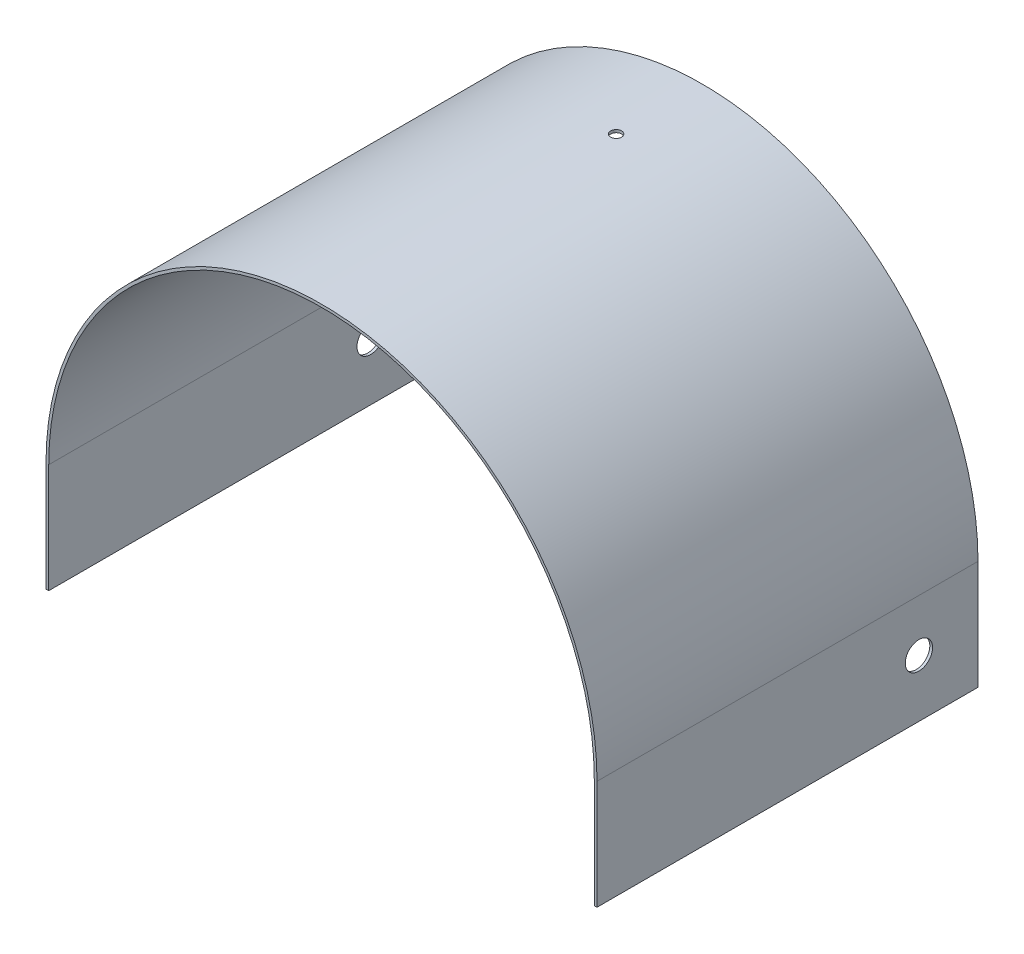
ISO-10303-21;
HEADER;
FILE_DESCRIPTION(('STEP AP214'),'2;1');
FILE_NAME('part.step','',(''),(''),'','','');
FILE_SCHEMA(('AUTOMOTIVE_DESIGN { 1 0 10303 214 1 1 1 1 }'));
ENDSEC;
DATA;
#1=APPLICATION_CONTEXT('core data for automotive mechanical design processes');
#2=APPLICATION_PROTOCOL_DEFINITION('international standard','automotive_design',2000,#1);
#3=PRODUCT_CONTEXT('',#1,'mechanical');
#4=PRODUCT('Part','Part','',(#3));
#5=PRODUCT_RELATED_PRODUCT_CATEGORY('part','',(#4));
#6=PRODUCT_DEFINITION_FORMATION('','',#4);
#7=PRODUCT_DEFINITION_CONTEXT('part definition',#1,'design');
#8=PRODUCT_DEFINITION('design','',#6,#7);
#9=PRODUCT_DEFINITION_SHAPE('','',#8);
#10=(LENGTH_UNIT() NAMED_UNIT(*) SI_UNIT(.MILLI.,.METRE.));
#11=(NAMED_UNIT(*) PLANE_ANGLE_UNIT() SI_UNIT($,.RADIAN.));
#12=(NAMED_UNIT(*) SI_UNIT($,.STERADIAN.) SOLID_ANGLE_UNIT());
#13=UNCERTAINTY_MEASURE_WITH_UNIT(LENGTH_MEASURE(1.E-05),#10,'distance_accuracy_value','');
#14=(GEOMETRIC_REPRESENTATION_CONTEXT(3) GLOBAL_UNCERTAINTY_ASSIGNED_CONTEXT((#13)) GLOBAL_UNIT_ASSIGNED_CONTEXT((#10,
#11,#12)) REPRESENTATION_CONTEXT('',''));
#15=CARTESIAN_POINT('',(0.,0.,0.));
#16=DIRECTION('',(0.,0.,1.));
#17=DIRECTION('',(1.,0.,0.));
#18=AXIS2_PLACEMENT_3D('',#15,#16,#17);
#19=CARTESIAN_POINT('',(0.,0.,419.));
#20=DIRECTION('',(0.,0.,-1.));
#21=DIRECTION('',(-1.,0.,0.));
#22=AXIS2_PLACEMENT_3D('',#19,#20,#21);
#23=CYLINDRICAL_SURFACE('',#22,300.);
#24=CARTESIAN_POINT('',(0.,0.,0.));
#25=DIRECTION('',(0.,0.,-1.));
#26=DIRECTION('',(1.,0.,0.));
#27=AXIS2_PLACEMENT_3D('',#24,#25,#26);
#28=CIRCLE('',#27,300.);
#29=CARTESIAN_POINT('',(-300.,0.,0.));
#30=VERTEX_POINT('',#29);
#31=CARTESIAN_POINT('',(300.,0.,0.));
#32=VERTEX_POINT('',#31);
#33=EDGE_CURVE('E143',#30,#32,#28,.T.);
#34=ORIENTED_EDGE('',*,*,#33,.T.);
#35=DIRECTION('',(0.,0.,-1.));
#36=VECTOR('',#35,1.);
#37=CARTESIAN_POINT('',(300.,0.,419.));
#38=LINE('',#37,#36);
#39=CARTESIAN_POINT('',(300.,0.,419.));
#40=VERTEX_POINT('',#39);
#41=EDGE_CURVE('E11',#40,#32,#38,.T.);
#42=ORIENTED_EDGE('',*,*,#41,.F.);
#43=CARTESIAN_POINT('',(0.,0.,419.));
#44=DIRECTION('',(0.,0.,-1.));
#45=DIRECTION('',(1.,0.,0.));
#46=AXIS2_PLACEMENT_3D('',#43,#44,#45);
#47=CIRCLE('',#46,300.);
#48=CARTESIAN_POINT('',(-300.,0.,419.));
#49=VERTEX_POINT('',#48);
#50=EDGE_CURVE('E166',#49,#40,#47,.T.);
#51=ORIENTED_EDGE('',*,*,#50,.F.);
#52=DIRECTION('',(0.,0.,-1.));
#53=VECTOR('',#52,1.);
#54=CARTESIAN_POINT('',(-300.,0.,419.));
#55=LINE('',#54,#53);
#56=EDGE_CURVE('E139',#49,#30,#55,.T.);
#57=ORIENTED_EDGE('',*,*,#56,.T.);
#58=EDGE_LOOP('',(#34,#42,#51,#57));
#59=FACE_BOUND('',#58,.T.);
#60=CARTESIAN_POINT('',(0.,300.,89.));
#61=CARTESIAN_POINT('',(0.168553858230472,300.000000068241,88.9999987733988));
#62=CARTESIAN_POINT('',(0.337087651004228,299.99985764915,89.0071055103724));
#63=CARTESIAN_POINT('',(0.67301334155086,299.999292096897,89.0354827302589));
#64=CARTESIAN_POINT('',(0.840404928349149,299.998868890145,89.0567569262242));
#65=CARTESIAN_POINT('',(1.17294656341957,299.997753113541,89.113348070108));
#66=CARTESIAN_POINT('',(1.33809448898002,299.997060304805,89.1486774724823));
#67=CARTESIAN_POINT('',(1.66488525226105,299.995424742031,89.2331422622268));
#68=CARTESIAN_POINT('',(1.82652678585594,299.994481896666,89.2822826945901));
#69=CARTESIAN_POINT('',(2.14495498208429,299.992374069846,89.3939664874669));
#70=CARTESIAN_POINT('',(2.30174565622852,299.991209277968,89.4564984151098));
#71=CARTESIAN_POINT('',(2.60955876874224,299.988689626029,89.5945706394047));
#72=CARTESIAN_POINT('',(2.76057905908212,299.987334696048,89.6701157236691));
#73=CARTESIAN_POINT('',(3.05562545339804,299.984474445913,89.8336104098739));
#74=CARTESIAN_POINT('',(3.19965580676147,299.982969218874,89.9215523451334));
#75=CARTESIAN_POINT('',(3.47985102215616,299.979849786212,90.109285778045));
#76=CARTESIAN_POINT('',(3.61601296124547,299.978235540568,90.209081637637));
#77=CARTESIAN_POINT('',(3.87942790635487,299.974944604516,90.4197729574059));
#78=CARTESIAN_POINT('',(4.00668215049199,299.973267922836,90.5306668697922));
#79=CARTESIAN_POINT('',(4.25144399262742,299.969898845993,90.7628210496901));
#80=CARTESIAN_POINT('',(4.36894797414363,299.968206445256,90.8840851300492));
#81=CARTESIAN_POINT('',(4.59328450657041,299.964855145037,91.1360408756582));
#82=CARTESIAN_POINT('',(4.70012056095244,299.963196234701,91.2667294213598));
#83=CARTESIAN_POINT('',(4.90244361565842,299.959957811916,91.5366907494251));
#84=CARTESIAN_POINT('',(4.99792641123446,299.958378329008,91.67596668336));
#85=CARTESIAN_POINT('',(5.17679089555855,299.955344741005,91.9620267361333));
#86=CARTESIAN_POINT('',(5.26017625038389,299.953890597981,92.1088085620301));
#87=CARTESIAN_POINT('',(5.41431594593107,299.951147900909,92.4089276392836));
#88=CARTESIAN_POINT('',(5.48506561136854,299.949859408202,92.5622672911741));
#89=CARTESIAN_POINT('',(5.61336909566321,299.947485766099,92.8743187379935));
#90=CARTESIAN_POINT('',(5.67092781073235,299.946400541282,93.0330285144561));
#91=CARTESIAN_POINT('',(5.77249070523254,299.944463010282,93.3547460350251));
#92=CARTESIAN_POINT('',(5.81648987328939,299.943610790226,93.5177553440599));
#93=CARTESIAN_POINT('',(5.92756222158679,299.941443980162,94.0113428689411));
#94=CARTESIAN_POINT('',(5.97386675736383,299.940516246092,94.3468623289017));
#95=CARTESIAN_POINT('',(6.00945759144473,299.939805099534,95.020731511803));
#96=CARTESIAN_POINT('',(5.99874404797377,299.940021683872,95.3590812268872));
#97=CARTESIAN_POINT('',(5.92068277966605,299.941572686304,96.0291781593714));
#98=CARTESIAN_POINT('',(5.85334314497856,299.942906944718,96.3609263130037));
#99=CARTESIAN_POINT('',(5.66393402146864,299.946543143238,97.0083950832594));
#100=CARTESIAN_POINT('',(5.54186444696804,299.948845084859,97.3241156747911));
#101=CARTESIAN_POINT('',(5.24645657638967,299.954157182576,97.9306088181144));
#102=CARTESIAN_POINT('',(5.07311456859348,299.957167389941,98.2213795617676));
#103=CARTESIAN_POINT('',(4.68008384313489,299.963556640206,98.7696948006937));
#104=CARTESIAN_POINT('',(4.46039508881227,299.966935683397,99.0272392696842));
#105=CARTESIAN_POINT('',(3.98086157857126,299.973682366281,99.5018395714632));
#106=CARTESIAN_POINT('',(3.72100979061492,299.977050003871,99.7188882992444));
#107=CARTESIAN_POINT('',(3.16855127351314,299.98339364921,100.106280826203));
#108=CARTESIAN_POINT('',(2.87594453967529,299.986369656902,100.27662461869));
#109=CARTESIAN_POINT('',(2.26627845669565,299.99159455733,100.565770995546));
#110=CARTESIAN_POINT('',(1.94921900578334,299.993843447039,100.684573365389));
#111=CARTESIAN_POINT('',(1.29964953495416,299.997360532835,100.867259961188));
#112=CARTESIAN_POINT('',(0.96713953411322,299.998628730134,100.931144254945));
#113=CARTESIAN_POINT('',(0.296169574849177,300.00004131015,101.002172555506));
#114=CARTESIAN_POINT('',(-0.0422893427890728,300.000185887525,101.009326390404));
#115=CARTESIAN_POINT('',(-0.715603584678769,299.99933544421,100.966716291153));
#116=CARTESIAN_POINT('',(-1.05045891069454,299.998340424079,100.916952384872));
#117=CARTESIAN_POINT('',(-1.70703315153619,299.995323073727,100.761927592567));
#118=CARTESIAN_POINT('',(-2.02875311824418,299.993300825942,100.656671159824));
#119=CARTESIAN_POINT('',(-2.64995628264556,299.98845696205,100.393653647259));
#120=CARTESIAN_POINT('',(-2.94943946204859,299.985635345286,100.235892524252));
#121=CARTESIAN_POINT('',(-3.51771300603613,299.979510258182,99.8723189375708));
#122=CARTESIAN_POINT('',(-3.78649913506642,299.976206721489,99.6664998547977));
#123=CARTESIAN_POINT('',(-4.28570602011926,299.969490407852,99.2126613630532));
#124=CARTESIAN_POINT('',(-4.51612672401084,299.96607763076,98.9646418967409));
#125=CARTESIAN_POINT('',(-4.93209505004579,299.959527011471,98.4334055019238));
#126=CARTESIAN_POINT('',(-5.1176363284909,299.95638920818,98.1501836061176));
#127=CARTESIAN_POINT('',(-5.43853361524466,299.950743001675,97.5565909749447));
#128=CARTESIAN_POINT('',(-5.57388970329694,299.94823459746,97.2462202827182));
#129=CARTESIAN_POINT('',(-5.79057007391362,299.944129959685,96.6072267406294));
#130=CARTESIAN_POINT('',(-5.87189848538252,299.942533656421,96.2786052876076));
#131=CARTESIAN_POINT('',(-5.97820318053439,299.940434172041,95.6121856863571));
#132=CARTESIAN_POINT('',(-6.00317942976562,299.939930991593,95.2743875325181));
#133=CARTESIAN_POINT('',(-5.99791622208006,299.940035385104,94.7685031516863));
#134=CARTESIAN_POINT('',(-5.98902697026025,299.940213649936,94.5999350798283));
#135=CARTESIAN_POINT('',(-5.9570906615953,299.940849789722,94.2641628280927));
#136=CARTESIAN_POINT('',(-5.93404883219527,299.941307561435,94.0969581677159));
#137=CARTESIAN_POINT('',(-5.87395382630987,299.942490413935,93.7650349959714));
#138=CARTESIAN_POINT('',(-5.83689545413359,299.943215593844,93.6003174301008));
#139=CARTESIAN_POINT('',(-5.74905109998643,299.9449121787,93.2746477776706));
#140=CARTESIAN_POINT('',(-5.6982701872105,299.945883492716,93.1136943244319));
#141=CARTESIAN_POINT('',(-5.5833127358983,299.948045370335,92.7965762524314));
#142=CARTESIAN_POINT('',(-5.51913102122051,299.949236018636,92.640413510922));
#143=CARTESIAN_POINT('',(-5.37786685443089,299.951802017892,92.3341076758469));
#144=CARTESIAN_POINT('',(-5.30078917019376,299.953177300548,92.1839623828583));
#145=CARTESIAN_POINT('',(-5.1342366530865,299.956074366952,91.8906485100324));
#146=CARTESIAN_POINT('',(-5.04475772645922,299.957596199026,91.7474822552183));
#147=CARTESIAN_POINT('',(-4.85409357079497,299.960742196294,91.4692484003796));
#148=CARTESIAN_POINT('',(-4.752912671849,299.962366323534,91.3341778326117));
#149=CARTESIAN_POINT('',(-4.53948974095126,299.96567207557,91.0729796559163));
#150=CARTESIAN_POINT('',(-4.42724287343257,299.967353725289,90.9468559983421));
#151=CARTESIAN_POINT('',(-4.19256641172907,299.970725486136,90.7045580201124));
#152=CARTESIAN_POINT('',(-4.07014058791838,299.972415593915,90.5883800475672));
#153=CARTESIAN_POINT('',(-3.81586115581725,299.975757981526,90.366677912347));
#154=CARTESIAN_POINT('',(-3.68400177227759,299.977410237355,90.2611603730178));
#155=CARTESIAN_POINT('',(-3.41191013313402,299.980628323875,90.0616481834702));
#156=CARTESIAN_POINT('',(-3.27168098160156,299.982194186198,89.9676493003651));
#157=CARTESIAN_POINT('',(-2.9836689903685,299.985197091643,89.791716112285));
#158=CARTESIAN_POINT('',(-2.83587930768592,299.986634014705,89.7097930068797));
#159=CARTESIAN_POINT('',(-2.53397375544395,299.989336069169,89.5587262899044));
#160=CARTESIAN_POINT('',(-2.37986021895453,299.9906012632,89.4895780161885));
#161=CARTESIAN_POINT('',(-2.06648857871364,299.992923496068,89.3645715273971));
#162=CARTESIAN_POINT('',(-1.90723516661103,299.993980718815,89.3087015610285));
#163=CARTESIAN_POINT('',(-1.58464103820291,299.995858195617,89.2105841507179));
#164=CARTESIAN_POINT('',(-1.42130140520578,299.996678511769,89.1683331366119));
#165=CARTESIAN_POINT('',(-1.05018119656422,299.998232691169,89.0888579627961));
#166=CARTESIAN_POINT('',(-0.841546888162112,299.998893036343,89.055564648355));
#167=CARTESIAN_POINT('',(-0.421931243310097,299.999776648027,89.0111364359515));
#168=CARTESIAN_POINT('',(-0.210949907163464,299.999999914595,89.000001535126));
#169=CARTESIAN_POINT('',(0.,300.,89.));
#170=B_SPLINE_CURVE_WITH_KNOTS('',3,(#60,#61,#62,#63,#64,#65,#66,#67,#68,#69,#70,#71,#72,#73,
#74,#75,#76,#77,#78,#79,#80,#81,#82,#83,#84,#85,#86,#87,#88,#89,#90,#91,#92,#93,#94,#95,#96,#97,
#98,#99,#100,#101,#102,#103,#104,#105,#106,#107,#108,#109,#110,#111,#112,#113,#114,#115,#116,
#117,#118,#119,#120,#121,#122,#123,#124,#125,#126,#127,#128,#129,#130,#131,#132,#133,#134,#135,
#136,#137,#138,#139,#140,#141,#142,#143,#144,#145,#146,#147,#148,#149,#150,#151,#152,#153,#154,
#155,#156,#157,#158,#159,#160,#161,#162,#163,#164,#165,#166,#167,#168,#169),.UNSPECIFIED.,.T.,
.F.,(4,2,2,2,2,2,2,2,2,2,2,2,2,2,2,2,2,2,2,2,2,2,2,2,2,2,2,2,2,2,2,2,2,2,2,2,2,2,2,2,2,2,2,2,2,
2,2,2,2,2,2,2,2,2,4),(0.,0.505477306172261,1.01108714159845,1.51714600432939,2.02338996471264,
2.5292034346336,3.03520339514278,3.54089178794572,4.04676684093719,4.55257144008682,
5.05856281696309,5.56438747003836,6.07039887864237,6.57625662091434,7.08230114769729,
7.58815753573841,8.09420065596796,9.10506499168799,10.1159265222608,11.1266436559431,
12.1373623718799,13.1481542737682,14.1589469751949,15.1699168545078,16.1808868786509,
17.1918611106088,18.2028340944066,19.2136319314304,20.2244292735449,21.2351455114116,
22.2458625806103,23.2567189396756,24.2675766722824,25.2785772060493,26.2895761333424,
27.3004977891584,28.3114200630165,28.8173352082005,29.323063599094,29.8289796388057,
30.3347090447466,30.8406341543279,31.3463726258568,31.8522784454382,32.3579976596077,
32.8639388489856,33.3696934611784,33.8757603917851,34.3816407911635,34.8879874519482,
35.3941489560381,35.8998608254371,36.4054400161013,37.0380592020858,37.6706783063277),.UNSPECIFIED.);
#171=CARTESIAN_POINT('',(0.,300.,89.));
#172=VERTEX_POINT('',#171);
#173=EDGE_CURVE('E148',#172,#172,#170,.T.);
#174=ORIENTED_EDGE('',*,*,#173,.F.);
#175=EDGE_LOOP('',(#174));
#176=FACE_BOUND('',#175,.T.);
#177=ADVANCED_FACE('F39',(#59,#176),#23,.F.);
#178=CARTESIAN_POINT('',(0.,0.,419.));
#179=DIRECTION('',(0.,0.,-1.));
#180=DIRECTION('',(-1.,0.,0.));
#181=AXIS2_PLACEMENT_3D('',#178,#179,#180);
#182=CYLINDRICAL_SURFACE('',#181,303.);
#183=CARTESIAN_POINT('',(0.,0.,0.));
#184=DIRECTION('',(0.,0.,1.));
#185=DIRECTION('',(1.,0.,0.));
#186=AXIS2_PLACEMENT_3D('',#183,#184,#185);
#187=CIRCLE('',#186,303.);
#188=CARTESIAN_POINT('',(303.,0.,0.));
#189=VERTEX_POINT('',#188);
#190=CARTESIAN_POINT('',(-303.,0.,0.));
#191=VERTEX_POINT('',#190);
#192=EDGE_CURVE('E157',#189,#191,#187,.T.);
#193=ORIENTED_EDGE('',*,*,#192,.T.);
#194=DIRECTION('',(0.,0.,-1.));
#195=VECTOR('',#194,1.);
#196=CARTESIAN_POINT('',(-303.,0.,419.));
#197=LINE('',#196,#195);
#198=CARTESIAN_POINT('',(-303.,0.,419.));
#199=VERTEX_POINT('',#198);
#200=EDGE_CURVE('E132',#199,#191,#197,.T.);
#201=ORIENTED_EDGE('',*,*,#200,.F.);
#202=CARTESIAN_POINT('',(0.,0.,419.));
#203=DIRECTION('',(0.,0.,1.));
#204=DIRECTION('',(1.,0.,0.));
#205=AXIS2_PLACEMENT_3D('',#202,#203,#204);
#206=CIRCLE('',#205,303.);
#207=CARTESIAN_POINT('',(303.,0.,419.));
#208=VERTEX_POINT('',#207);
#209=EDGE_CURVE('E121',#208,#199,#206,.T.);
#210=ORIENTED_EDGE('',*,*,#209,.F.);
#211=DIRECTION('',(0.,0.,-1.));
#212=VECTOR('',#211,1.);
#213=CARTESIAN_POINT('',(303.,0.,419.));
#214=LINE('',#213,#212);
#215=EDGE_CURVE('E173',#208,#189,#214,.T.);
#216=ORIENTED_EDGE('',*,*,#215,.T.);
#217=EDGE_LOOP('',(#193,#201,#210,#216));
#218=FACE_BOUND('',#217,.T.);
#219=CARTESIAN_POINT('',(0.,303.,89.));
#220=CARTESIAN_POINT('',(-0.168554215296146,303.000000067548,88.9999987737291));
#221=CARTESIAN_POINT('',(-0.337088369366971,302.999859057958,89.0071055406586));
#222=CARTESIAN_POINT('',(-0.673014785065731,302.999299102854,89.0354828825973));
#223=CARTESIAN_POINT('',(-0.840406735697271,302.998880084473,89.0567571709337));
#224=CARTESIAN_POINT('',(-1.17294911322418,302.997775350431,89.113348566951));
#225=CARTESIAN_POINT('',(-1.33809741723393,302.997089398228,89.1486781301781));
#226=CARTESIAN_POINT('',(-1.66488893537052,302.99547002224,89.2331433133884));
#227=CARTESIAN_POINT('',(-1.82653084537257,302.99453650803,89.2822839783848));
#228=CARTESIAN_POINT('',(-2.14495980197021,302.992449542042,89.3939683178728));
#229=CARTESIAN_POINT('',(-2.30175085958986,302.991296277942,89.4565005608382));
#230=CARTESIAN_POINT('',(-2.60956471817017,302.988801562987,89.5945734964313));
#231=CARTESIAN_POINT('',(-2.76058537109427,302.987460042905,89.6701189766994));
#232=CARTESIAN_POINT('',(-3.0556324495974,302.984628101649,89.8336145312125));
#233=CARTESIAN_POINT('',(-3.19966312483456,302.983137772675,89.9215569382787));
#234=CARTESIAN_POINT('',(-3.47985893278222,302.980049215683,90.1092913884023));
#235=CARTESIAN_POINT('',(-3.61602114254087,302.97845094804,90.2090877934132));
#236=CARTESIAN_POINT('',(-3.87943623636626,302.975192591365,90.4197800080983));
#237=CARTESIAN_POINT('',(-4.00669038043927,302.973532511128,90.5306742426208));
#238=CARTESIAN_POINT('',(-4.25145198926723,302.970196794332,90.762829067807));
#239=CARTESIAN_POINT('',(-4.36895583753094,302.968521152255,90.8840934713152));
#240=CARTESIAN_POINT('',(-4.5932920628891,302.965203039354,91.1360498523672));
#241=CARTESIAN_POINT('',(-4.70012794352767,302.963560557781,91.2667387103132));
#242=CARTESIAN_POINT('',(-4.9024506075821,302.960354208071,91.5367006407404));
#243=CARTESIAN_POINT('',(-4.99793318623189,302.958790369183,91.6759768647863));
#244=CARTESIAN_POINT('',(-5.17679704579534,302.955786831847,91.9620372259973));
#245=CARTESIAN_POINT('',(-5.26018201280468,302.954347095642,92.1088190577189));
#246=CARTESIAN_POINT('',(-5.41432093733857,302.951631573303,92.408938082378));
#247=CARTESIAN_POINT('',(-5.48507021959253,302.950355847903,92.5622776758192));
#248=CARTESIAN_POINT('',(-5.61337295314574,302.94800572709,92.8743289423943));
#249=CARTESIAN_POINT('',(-5.67093130046801,302.946931257005,93.0330385971618));
#250=CARTESIAN_POINT('',(-5.77249348467344,302.945012928721,93.354755812937));
#251=CARTESIAN_POINT('',(-5.81649231017521,302.944169155797,93.5177649388555));
#252=CARTESIAN_POINT('',(-5.92756388341613,302.942023821549,94.0113527120342));
#253=CARTESIAN_POINT('',(-5.97386789171449,302.941105286819,94.3468725553296));
#254=CARTESIAN_POINT('',(-6.00945757081799,302.940401206852,95.0207423894311));
#255=CARTESIAN_POINT('',(-5.99874339875513,302.940615658492,95.3590923724354));
#256=CARTESIAN_POINT('',(-5.92068066733371,302.942151326951,96.0291907237805));
#257=CARTESIAN_POINT('',(-5.85334003824124,302.943472388795,96.3609400098584));
#258=CARTESIAN_POINT('',(-5.66392850064709,302.947072615467,97.0084108776592));
#259=CARTESIAN_POINT('',(-5.54185750701585,302.949351781784,97.3241324344511));
#260=CARTESIAN_POINT('',(-5.24644659758117,302.954611313467,97.9306267937247));
#261=CARTESIAN_POINT('',(-5.07310304344614,302.95759172859,98.2213978238123));
#262=CARTESIAN_POINT('',(-4.68006901573475,302.963917738518,98.7697133027553));
#263=CARTESIAN_POINT('',(-4.4603785065897,302.967263333603,99.0272577261108));
#264=CARTESIAN_POINT('',(-3.98084223140954,302.973943214034,99.5018566743061));
#265=CARTESIAN_POINT('',(-3.72098957182266,302.977277497339,99.7189042339999));
#266=CARTESIAN_POINT('',(-3.16852959342518,302.983558304554,100.10629427146));
#267=CARTESIAN_POINT('',(-2.87592226993102,302.98650482841,100.276636742547));
#268=CARTESIAN_POINT('',(-2.26625538566384,302.991677954565,100.565780375342));
#269=CARTESIAN_POINT('',(-1.9491957252022,302.993904553929,100.68458132691));
#270=CARTESIAN_POINT('',(-1.29962618594767,302.997386766501,100.867265113795));
#271=CARTESIAN_POINT('',(-0.967116325868064,302.998642380885,100.931148015626));
#272=CARTESIAN_POINT('',(-0.296145780574652,303.000040925328,101.002173770602));
#273=CARTESIAN_POINT('',(0.0423138844003435,303.000184044321,101.009326258252));
#274=CARTESIAN_POINT('',(0.715629398067253,302.999341963729,100.966713236529));
#275=CARTESIAN_POINT('',(1.05048524848561,302.998356764684,100.916947754423));
#276=CARTESIAN_POINT('',(1.70706083819987,302.995369225586,100.761919467207));
#277=CARTESIAN_POINT('',(2.02878160863232,302.99336696554,100.656661027492));
#278=CARTESIAN_POINT('',(2.64998601896266,302.988570994259,100.393639126213));
#279=CARTESIAN_POINT('',(2.94946964098662,302.985777282386,100.235875622447));
#280=CARTESIAN_POINT('',(3.51774280341795,302.979712793768,99.8722974667531));
#281=CARTESIAN_POINT('',(3.78652819165779,302.976441952623,99.6664763261024));
#282=CARTESIAN_POINT('',(4.28573318617051,302.969792127865,99.2126337784078));
#283=CARTESIAN_POINT('',(4.51615274103415,302.966413144107,98.9646123148174));
#284=CARTESIAN_POINT('',(4.93211774479725,302.959927416248,98.4333728724535));
#285=CARTESIAN_POINT('',(5.11765697476844,302.956820709914,98.1501500241545));
#286=CARTESIAN_POINT('',(5.43855004895211,302.951230477232,97.5565559672592));
#287=CARTESIAN_POINT('',(5.57390397238206,302.948746949901,97.2461848015175));
#288=CARTESIAN_POINT('',(5.79058018001749,302.944683035885,96.6071903345979));
#289=CARTESIAN_POINT('',(5.87190651240923,302.943102581535,96.2785684029154));
#290=CARTESIAN_POINT('',(5.97820700919171,302.941023972133,95.6121482667512));
#291=CARTESIAN_POINT('',(6.00318113780743,302.940525817768,95.2743500564442));
#292=CARTESIAN_POINT('',(5.99791477459651,302.940629239767,94.7684652674413));
#293=CARTESIAN_POINT('',(5.98902442265795,302.940805760662,94.599896716908));
#294=CARTESIAN_POINT('',(5.95708583098366,302.941435644197,94.264123598081));
#295=CARTESIAN_POINT('',(5.93404281870261,302.941888904619,94.0969185492567));
#296=CARTESIAN_POINT('',(5.87394536859085,302.943060087437,93.7649946928867));
#297=CARTESIAN_POINT('',(5.83688573499398,302.943778107975,93.6002768308812));
#298=CARTESIAN_POINT('',(5.74903878439452,302.945457935242,93.2746066851142));
#299=CARTESIAN_POINT('',(5.69825653665652,302.94641965194,93.1136530346259));
#300=CARTESIAN_POINT('',(5.58329634415772,302.94856016271,92.7965346710454));
#301=CARTESIAN_POINT('',(5.51911322292979,302.949739040647,92.6403718353552));
#302=CARTESIAN_POINT('',(5.37784618037451,302.952279668458,92.3340659307326));
#303=CARTESIAN_POINT('',(5.30076702699085,302.953641350709,92.1839206623127));
#304=CARTESIAN_POINT('',(5.13421151946628,302.956509763238,91.89060697355));
#305=CARTESIAN_POINT('',(5.04473107179592,302.95801654136,91.7474408781348));
#306=CARTESIAN_POINT('',(4.85406383630653,302.96113141435,91.4692074892884));
#307=CARTESIAN_POINT('',(4.75288137865346,302.962739471642,91.3341372280183));
#308=CARTESIAN_POINT('',(4.53945567722161,302.966012505056,91.0729402749876));
#309=CARTESIAN_POINT('',(4.42720763577798,302.967677505661,90.9468175036722));
#310=CARTESIAN_POINT('',(4.19252889728217,302.971015880153,90.7045213998138));
#311=CARTESIAN_POINT('',(4.07010197060943,302.972689250726,90.5883444153134));
#312=CARTESIAN_POINT('',(3.81582041792857,302.97599853405,90.3666443579015));
#313=CARTESIAN_POINT('',(3.68396001664583,302.977634423031,90.2611279084897));
#314=CARTESIAN_POINT('',(3.41186644612551,302.980820627162,90.0616179967798));
#315=CARTESIAN_POINT('',(3.27163638091481,302.982370973631,89.9676203015674));
#316=CARTESIAN_POINT('',(2.98362289780828,302.985344116344,89.7916897129227));
#317=CARTESIAN_POINT('',(2.83583264819054,302.986766793905,89.7097680008957));
#318=CARTESIAN_POINT('',(2.53392611294775,302.989442054968,89.5587041092706));
#319=CARTESIAN_POINT('',(2.37981216032925,302.990694700477,89.4895572675286));
#320=CARTESIAN_POINT('',(2.06643985230256,302.992993894542,89.3645536666566));
#321=CARTESIAN_POINT('',(1.90718618868656,302.9940406252,89.3086851555086));
#322=CARTESIAN_POINT('',(1.58459171168013,302.995899462167,89.2105706572549));
#323=CARTESIAN_POINT('',(1.42125198161369,302.996711629963,89.168321099802));
#324=CARTESIAN_POINT('',(1.05013959416196,302.998250328227,89.0888508710661));
#325=CARTESIAN_POINT('',(0.841513428323513,302.998904083596,89.0555602109202));
#326=CARTESIAN_POINT('',(0.42191436822188,302.999778877188,89.0111355441141));
#327=CARTESIAN_POINT('',(0.210941474255892,302.999999915465,89.000001534648));
#328=CARTESIAN_POINT('',(0.,303.,89.));
#329=B_SPLINE_CURVE_WITH_KNOTS('',3,(#219,#220,#221,#222,#223,#224,#225,#226,#227,#228,#229,
#230,#231,#232,#233,#234,#235,#236,#237,#238,#239,#240,#241,#242,#243,#244,#245,#246,#247,#248,
#249,#250,#251,#252,#253,#254,#255,#256,#257,#258,#259,#260,#261,#262,#263,#264,#265,#266,#267,
#268,#269,#270,#271,#272,#273,#274,#275,#276,#277,#278,#279,#280,#281,#282,#283,#284,#285,#286,
#287,#288,#289,#290,#291,#292,#293,#294,#295,#296,#297,#298,#299,#300,#301,#302,#303,#304,#305,
#306,#307,#308,#309,#310,#311,#312,#313,#314,#315,#316,#317,#318,#319,#320,#321,#322,#323,#324,
#325,#326,#327,#328),.UNSPECIFIED.,.T.,.F.,(4,2,2,2,2,2,2,2,2,2,2,2,2,2,2,2,2,2,2,2,2,2,2,2,2,2,
2,2,2,2,2,2,2,2,2,2,2,2,2,2,2,2,2,2,2,2,2,2,2,2,2,2,2,2,4),(0.,0.505478384893003,
1.01108930854777,1.51714929767489,2.02339438463165,2.52920903322682,3.03521017277642,
3.5408997256381,4.04677593854355,4.5525804523193,5.05857174363091,5.56439630833887,
6.07040762864282,6.57626444397525,7.08230804299854,7.58816351067818,8.09420571082227,
9.10507091548448,10.1159333343828,11.1266542103776,12.1373766584893,13.1481708452846,
14.1589658078109,15.1699344592825,16.1809032553119,17.1918761731319,18.2028478664935,
19.2136478632229,20.2244473756971,21.2351673847124,22.2458882061214,23.2567455736443,
24.267604295679,25.2786030091537,26.2896001267603,27.3005214836988,28.3114434824176,
28.8173602284695,29.3230902203943,29.8290078634052,30.3347388704983,30.8406655931435,
31.3464056753556,31.8523130961253,32.3580339082781,32.8639749564425,33.3697294259284,
33.8757962180147,34.381676479302,34.888022242529,35.3941828500451,35.8998937966576,
36.4054720579716,37.0380659627262,37.6706597873688),.UNSPECIFIED.);
#330=CARTESIAN_POINT('',(0.,303.,89.));
#331=VERTEX_POINT('',#330);
#332=EDGE_CURVE('E183',#331,#331,#329,.T.);
#333=ORIENTED_EDGE('',*,*,#332,.F.);
#334=EDGE_LOOP('',(#333));
#335=FACE_BOUND('',#334,.T.);
#336=ADVANCED_FACE('F192',(#218,#335),#182,.T.);
#337=CARTESIAN_POINT('',(300.,-120.,419.));
#338=DIRECTION('',(1.,0.,0.));
#339=DIRECTION('',(0.,1.,0.));
#340=AXIS2_PLACEMENT_3D('',#337,#338,#339);
#341=PLANE('',#340);
#342=CARTESIAN_POINT('',(300.,-57.08,65.));
#343=DIRECTION('',(1.,0.,0.));
#344=DIRECTION('',(0.,1.,0.));
#345=AXIS2_PLACEMENT_3D('',#342,#343,#344);
#346=CIRCLE('',#345,15.);
#347=CARTESIAN_POINT('',(300.,-42.08,65.));
#348=VERTEX_POINT('',#347);
#349=EDGE_CURVE('E191',#348,#348,#346,.T.);
#350=ORIENTED_EDGE('',*,*,#349,.T.);
#351=EDGE_LOOP('',(#350));
#352=FACE_BOUND('',#351,.T.);
#353=DIRECTION('',(0.,-1.,0.));
#354=VECTOR('',#353,1.);
#355=CARTESIAN_POINT('',(300.,-120.,0.));
#356=LINE('',#355,#354);
#357=CARTESIAN_POINT('',(300.,-120.,0.));
#358=VERTEX_POINT('',#357);
#359=EDGE_CURVE('E147',#32,#358,#356,.T.);
#360=ORIENTED_EDGE('',*,*,#359,.T.);
#361=DIRECTION('',(0.,0.,-1.));
#362=VECTOR('',#361,1.);
#363=CARTESIAN_POINT('',(300.,-120.,419.));
#364=LINE('',#363,#362);
#365=CARTESIAN_POINT('',(300.,-120.,419.));
#366=VERTEX_POINT('',#365);
#367=EDGE_CURVE('E50',#366,#358,#364,.T.);
#368=ORIENTED_EDGE('',*,*,#367,.F.);
#369=DIRECTION('',(0.,-1.,0.));
#370=VECTOR('',#369,1.);
#371=CARTESIAN_POINT('',(300.,-120.,419.));
#372=LINE('',#371,#370);
#373=EDGE_CURVE('E102',#40,#366,#372,.T.);
#374=ORIENTED_EDGE('',*,*,#373,.F.);
#375=ORIENTED_EDGE('',*,*,#41,.T.);
#376=EDGE_LOOP('',(#360,#368,#374,#375));
#377=FACE_BOUND('',#376,.T.);
#378=ADVANCED_FACE('F259',(#352,#377),#341,.F.);
#379=CARTESIAN_POINT('',(300.,-120.,419.));
#380=DIRECTION('',(0.,1.,0.));
#381=DIRECTION('',(0.,0.,1.));
#382=AXIS2_PLACEMENT_3D('',#379,#380,#381);
#383=PLANE('',#382);
#384=DIRECTION('',(1.,0.,0.));
#385=VECTOR('',#384,1.);
#386=CARTESIAN_POINT('',(300.,-120.,0.));
#387=LINE('',#386,#385);
#388=CARTESIAN_POINT('',(303.,-120.,0.));
#389=VERTEX_POINT('',#388);
#390=EDGE_CURVE('E151',#358,#389,#387,.T.);
#391=ORIENTED_EDGE('',*,*,#390,.T.);
#392=DIRECTION('',(0.,0.,-1.));
#393=VECTOR('',#392,1.);
#394=CARTESIAN_POINT('',(303.,-120.,419.));
#395=LINE('',#394,#393);
#396=CARTESIAN_POINT('',(303.,-120.,419.));
#397=VERTEX_POINT('',#396);
#398=EDGE_CURVE('E177',#397,#389,#395,.T.);
#399=ORIENTED_EDGE('',*,*,#398,.F.);
#400=DIRECTION('',(1.,0.,0.));
#401=VECTOR('',#400,1.);
#402=CARTESIAN_POINT('',(300.,-120.,419.));
#403=LINE('',#402,#401);
#404=EDGE_CURVE('E220',#366,#397,#403,.T.);
#405=ORIENTED_EDGE('',*,*,#404,.F.);
#406=ORIENTED_EDGE('',*,*,#367,.T.);
#407=EDGE_LOOP('',(#391,#399,#405,#406));
#408=FACE_BOUND('',#407,.T.);
#409=ADVANCED_FACE('F252',(#408),#383,.F.);
#410=CARTESIAN_POINT('',(303.,-120.,419.));
#411=DIRECTION('',(-1.,0.,0.));
#412=DIRECTION('',(0.,0.,1.));
#413=AXIS2_PLACEMENT_3D('',#410,#411,#412);
#414=PLANE('',#413);
#415=CARTESIAN_POINT('',(303.,-57.08,65.));
#416=DIRECTION('',(-1.,0.,0.));
#417=DIRECTION('',(0.,0.,1.));
#418=AXIS2_PLACEMENT_3D('',#415,#416,#417);
#419=CIRCLE('',#418,15.);
#420=CARTESIAN_POINT('',(303.,-57.08,80.));
#421=VERTEX_POINT('',#420);
#422=EDGE_CURVE('E229',#421,#421,#419,.T.);
#423=ORIENTED_EDGE('',*,*,#422,.T.);
#424=EDGE_LOOP('',(#423));
#425=FACE_BOUND('',#424,.T.);
#426=DIRECTION('',(0.,1.,0.));
#427=VECTOR('',#426,1.);
#428=CARTESIAN_POINT('',(303.,-120.,0.));
#429=LINE('',#428,#427);
#430=EDGE_CURVE('E154',#389,#189,#429,.T.);
#431=ORIENTED_EDGE('',*,*,#430,.T.);
#432=ORIENTED_EDGE('',*,*,#215,.F.);
#433=DIRECTION('',(0.,1.,0.));
#434=VECTOR('',#433,1.);
#435=CARTESIAN_POINT('',(303.,-120.,419.));
#436=LINE('',#435,#434);
#437=EDGE_CURVE('E223',#397,#208,#436,.T.);
#438=ORIENTED_EDGE('',*,*,#437,.F.);
#439=ORIENTED_EDGE('',*,*,#398,.T.);
#440=EDGE_LOOP('',(#431,#432,#438,#439));
#441=FACE_BOUND('',#440,.T.);
#442=ADVANCED_FACE('F246',(#425,#441),#414,.F.);
#443=CARTESIAN_POINT('',(-303.,0.,419.));
#444=DIRECTION('',(1.,0.,0.));
#445=DIRECTION('',(0.,0.,-1.));
#446=AXIS2_PLACEMENT_3D('',#443,#444,#445);
#447=PLANE('',#446);
#448=CARTESIAN_POINT('',(-303.,-57.08,65.));
#449=DIRECTION('',(1.,0.,0.));
#450=DIRECTION('',(0.,0.,-1.));
#451=AXIS2_PLACEMENT_3D('',#448,#449,#450);
#452=CIRCLE('',#451,15.);
#453=CARTESIAN_POINT('',(-303.,-57.08,50.));
#454=VERTEX_POINT('',#453);
#455=EDGE_CURVE('E232',#454,#454,#452,.T.);
#456=ORIENTED_EDGE('',*,*,#455,.T.);
#457=EDGE_LOOP('',(#456));
#458=FACE_BOUND('',#457,.T.);
#459=DIRECTION('',(0.,-1.,0.));
#460=VECTOR('',#459,1.);
#461=CARTESIAN_POINT('',(-303.,0.,0.));
#462=LINE('',#461,#460);
#463=CARTESIAN_POINT('',(-303.,-120.,0.));
#464=VERTEX_POINT('',#463);
#465=EDGE_CURVE('E130',#191,#464,#462,.T.);
#466=ORIENTED_EDGE('',*,*,#465,.T.);
#467=DIRECTION('',(0.,0.,-1.));
#468=VECTOR('',#467,1.);
#469=CARTESIAN_POINT('',(-303.,-120.,419.));
#470=LINE('',#469,#468);
#471=CARTESIAN_POINT('',(-303.,-120.,419.));
#472=VERTEX_POINT('',#471);
#473=EDGE_CURVE('E127',#472,#464,#470,.T.);
#474=ORIENTED_EDGE('',*,*,#473,.F.);
#475=DIRECTION('',(0.,-1.,0.));
#476=VECTOR('',#475,1.);
#477=CARTESIAN_POINT('',(-303.,0.,419.));
#478=LINE('',#477,#476);
#479=EDGE_CURVE('E115',#199,#472,#478,.T.);
#480=ORIENTED_EDGE('',*,*,#479,.F.);
#481=ORIENTED_EDGE('',*,*,#200,.T.);
#482=EDGE_LOOP('',(#466,#474,#480,#481));
#483=FACE_BOUND('',#482,.T.);
#484=ADVANCED_FACE('F128',(#458,#483),#447,.F.);
#485=CARTESIAN_POINT('',(-300.,-120.,419.));
#486=DIRECTION('',(0.,1.,0.));
#487=DIRECTION('',(0.,0.,1.));
#488=AXIS2_PLACEMENT_3D('',#485,#486,#487);
#489=PLANE('',#488);
#490=DIRECTION('',(1.,0.,0.));
#491=VECTOR('',#490,1.);
#492=CARTESIAN_POINT('',(-300.,-120.,0.));
#493=LINE('',#492,#491);
#494=CARTESIAN_POINT('',(-300.,-120.,0.));
#495=VERTEX_POINT('',#494);
#496=EDGE_CURVE('E88',#464,#495,#493,.T.);
#497=ORIENTED_EDGE('',*,*,#496,.T.);
#498=DIRECTION('',(0.,0.,-1.));
#499=VECTOR('',#498,1.);
#500=CARTESIAN_POINT('',(-300.,-120.,419.));
#501=LINE('',#500,#499);
#502=CARTESIAN_POINT('',(-300.,-120.,419.));
#503=VERTEX_POINT('',#502);
#504=EDGE_CURVE('E133',#503,#495,#501,.T.);
#505=ORIENTED_EDGE('',*,*,#504,.F.);
#506=DIRECTION('',(1.,0.,0.));
#507=VECTOR('',#506,1.);
#508=CARTESIAN_POINT('',(-300.,-120.,419.));
#509=LINE('',#508,#507);
#510=EDGE_CURVE('E119',#472,#503,#509,.T.);
#511=ORIENTED_EDGE('',*,*,#510,.F.);
#512=ORIENTED_EDGE('',*,*,#473,.T.);
#513=EDGE_LOOP('',(#497,#505,#511,#512));
#514=FACE_BOUND('',#513,.T.);
#515=ADVANCED_FACE('F135',(#514),#489,.F.);
#516=CARTESIAN_POINT('',(-300.,0.,419.));
#517=DIRECTION('',(-1.,0.,0.));
#518=DIRECTION('',(0.,-1.,0.));
#519=AXIS2_PLACEMENT_3D('',#516,#517,#518);
#520=PLANE('',#519);
#521=CARTESIAN_POINT('',(-300.,-57.08,65.));
#522=DIRECTION('',(-1.,0.,0.));
#523=DIRECTION('',(0.,-1.,0.));
#524=AXIS2_PLACEMENT_3D('',#521,#522,#523);
#525=CIRCLE('',#524,15.);
#526=CARTESIAN_POINT('',(-300.,-72.08,65.));
#527=VERTEX_POINT('',#526);
#528=EDGE_CURVE('E43',#527,#527,#525,.T.);
#529=ORIENTED_EDGE('',*,*,#528,.T.);
#530=EDGE_LOOP('',(#529));
#531=FACE_BOUND('',#530,.T.);
#532=DIRECTION('',(0.,1.,0.));
#533=VECTOR('',#532,1.);
#534=CARTESIAN_POINT('',(-300.,0.,0.));
#535=LINE('',#534,#533);
#536=EDGE_CURVE('E94',#495,#30,#535,.T.);
#537=ORIENTED_EDGE('',*,*,#536,.T.);
#538=ORIENTED_EDGE('',*,*,#56,.F.);
#539=DIRECTION('',(0.,1.,0.));
#540=VECTOR('',#539,1.);
#541=CARTESIAN_POINT('',(-300.,0.,419.));
#542=LINE('',#541,#540);
#543=EDGE_CURVE('E59',#503,#49,#542,.T.);
#544=ORIENTED_EDGE('',*,*,#543,.F.);
#545=ORIENTED_EDGE('',*,*,#504,.T.);
#546=EDGE_LOOP('',(#537,#538,#544,#545));
#547=FACE_BOUND('',#546,.T.);
#548=ADVANCED_FACE('F239',(#531,#547),#520,.F.);
#549=CARTESIAN_POINT('',(0.,0.,419.));
#550=DIRECTION('',(0.,0.,1.));
#551=DIRECTION('',(1.,0.,0.));
#552=AXIS2_PLACEMENT_3D('',#549,#550,#551);
#553=PLANE('',#552);
#554=ORIENTED_EDGE('',*,*,#50,.T.);
#555=ORIENTED_EDGE('',*,*,#373,.T.);
#556=ORIENTED_EDGE('',*,*,#404,.T.);
#557=ORIENTED_EDGE('',*,*,#437,.T.);
#558=ORIENTED_EDGE('',*,*,#209,.T.);
#559=ORIENTED_EDGE('',*,*,#479,.T.);
#560=ORIENTED_EDGE('',*,*,#510,.T.);
#561=ORIENTED_EDGE('',*,*,#543,.T.);
#562=EDGE_LOOP('',(#554,#555,#556,#557,#558,#559,#560,#561));
#563=FACE_BOUND('',#562,.T.);
#564=ADVANCED_FACE('F117',(#563),#553,.T.);
#565=CARTESIAN_POINT('',(0.,0.,0.));
#566=DIRECTION('',(0.,0.,1.));
#567=DIRECTION('',(1.,0.,0.));
#568=AXIS2_PLACEMENT_3D('',#565,#566,#567);
#569=PLANE('',#568);
#570=ORIENTED_EDGE('',*,*,#33,.F.);
#571=ORIENTED_EDGE('',*,*,#536,.F.);
#572=ORIENTED_EDGE('',*,*,#496,.F.);
#573=ORIENTED_EDGE('',*,*,#465,.F.);
#574=ORIENTED_EDGE('',*,*,#192,.F.);
#575=ORIENTED_EDGE('',*,*,#430,.F.);
#576=ORIENTED_EDGE('',*,*,#390,.F.);
#577=ORIENTED_EDGE('',*,*,#359,.F.);
#578=EDGE_LOOP('',(#570,#571,#572,#573,#574,#575,#576,#577));
#579=FACE_BOUND('',#578,.T.);
#580=ADVANCED_FACE('F202',(#579),#569,.F.);
#581=CARTESIAN_POINT('',(0.,490.,95.));
#582=DIRECTION('',(0.,-1.,0.));
#583=DIRECTION('',(0.,0.,-1.));
#584=AXIS2_PLACEMENT_3D('',#581,#582,#583);
#585=CYLINDRICAL_SURFACE('',#584,6.);
#586=ORIENTED_EDGE('',*,*,#332,.T.);
#587=EDGE_LOOP('',(#586));
#588=FACE_BOUND('',#587,.T.);
#589=ORIENTED_EDGE('',*,*,#173,.T.);
#590=EDGE_LOOP('',(#589));
#591=FACE_BOUND('',#590,.T.);
#592=ADVANCED_FACE('F196',(#588,#591),#585,.F.);
#593=CARTESIAN_POINT('',(-500.,-57.08,65.));
#594=DIRECTION('',(1.,0.,0.));
#595=DIRECTION('',(0.,0.,-1.));
#596=AXIS2_PLACEMENT_3D('',#593,#594,#595);
#597=CYLINDRICAL_SURFACE('',#596,15.);
#598=ORIENTED_EDGE('',*,*,#528,.F.);
#599=EDGE_LOOP('',(#598));
#600=FACE_BOUND('',#599,.T.);
#601=ORIENTED_EDGE('',*,*,#455,.F.);
#602=EDGE_LOOP('',(#601));
#603=FACE_BOUND('',#602,.T.);
#604=ADVANCED_FACE('F201',(#600,#603),#597,.F.);
#605=ORIENTED_EDGE('',*,*,#422,.F.);
#606=EDGE_LOOP('',(#605));
#607=FACE_BOUND('',#606,.T.);
#608=ORIENTED_EDGE('',*,*,#349,.F.);
#609=EDGE_LOOP('',(#608));
#610=FACE_BOUND('',#609,.T.);
#611=ADVANCED_FACE('F204',(#607,#610),#597,.F.);
#612=CLOSED_SHELL('',(#177,#336,#378,#409,#442,#484,#515,#548,#564,#580,#592,#604,#611));
#613=MANIFOLD_SOLID_BREP('B2',#612);
#614=ADVANCED_BREP_SHAPE_REPRESENTATION('',(#18,#613),#14);
#615=SHAPE_DEFINITION_REPRESENTATION(#9,#614);
ENDSEC;
END-ISO-10303-21;
